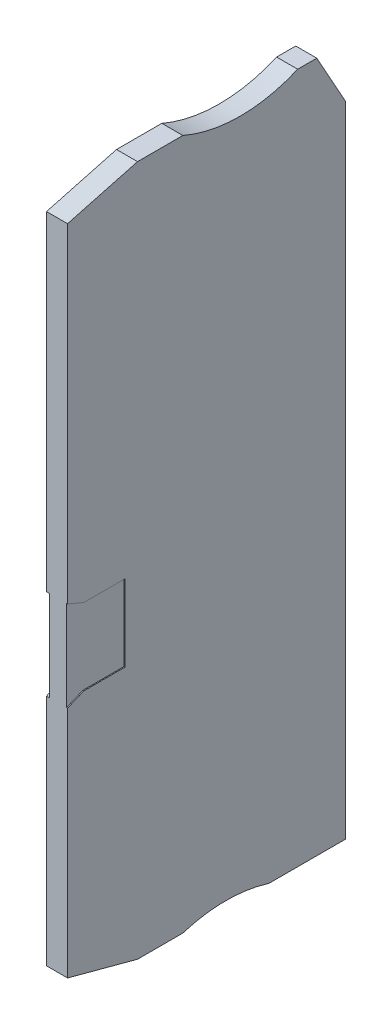
ISO-10303-21;
HEADER;
FILE_DESCRIPTION(('STEP AP214'),'2;1');
FILE_NAME('part.step','',(''),(''),'','','');
FILE_SCHEMA(('AUTOMOTIVE_DESIGN { 1 0 10303 214 1 1 1 1 }'));
ENDSEC;
DATA;
#1=APPLICATION_CONTEXT('core data for automotive mechanical design processes');
#2=APPLICATION_PROTOCOL_DEFINITION('international standard','automotive_design',2000,#1);
#3=PRODUCT_CONTEXT('',#1,'mechanical');
#4=PRODUCT('Part','Part','',(#3));
#5=PRODUCT_RELATED_PRODUCT_CATEGORY('part','',(#4));
#6=PRODUCT_DEFINITION_FORMATION('','',#4);
#7=PRODUCT_DEFINITION_CONTEXT('part definition',#1,'design');
#8=PRODUCT_DEFINITION('design','',#6,#7);
#9=PRODUCT_DEFINITION_SHAPE('','',#8);
#10=(LENGTH_UNIT() NAMED_UNIT(*) SI_UNIT(.MILLI.,.METRE.));
#11=(NAMED_UNIT(*) PLANE_ANGLE_UNIT() SI_UNIT($,.RADIAN.));
#12=(NAMED_UNIT(*) SI_UNIT($,.STERADIAN.) SOLID_ANGLE_UNIT());
#13=UNCERTAINTY_MEASURE_WITH_UNIT(LENGTH_MEASURE(1.E-05),#10,'distance_accuracy_value','');
#14=(GEOMETRIC_REPRESENTATION_CONTEXT(3) GLOBAL_UNCERTAINTY_ASSIGNED_CONTEXT((#13)) GLOBAL_UNIT_ASSIGNED_CONTEXT((#10,
#11,#12)) REPRESENTATION_CONTEXT('',''));
#15=CARTESIAN_POINT('',(0.,0.,0.));
#16=DIRECTION('',(0.,0.,1.));
#17=DIRECTION('',(1.,0.,0.));
#18=AXIS2_PLACEMENT_3D('',#15,#16,#17);
#19=CARTESIAN_POINT('',(0.,27.1000000000009,27.3499999999963));
#20=DIRECTION('',(0.,-0.92110933002153,-0.389303997086196));
#21=DIRECTION('',(0.,0.389303997086196,-0.92110933002153));
#22=AXIS2_PLACEMENT_3D('',#19,#20,#21);
#23=PLANE('',#22);
#24=DIRECTION('',(0.,0.389303997086173,-0.921109330021539));
#25=VECTOR('',#24,1.);
#26=CARTESIAN_POINT('',(0.299999999999995,26.3815002807196,29.0499999999999));
#27=LINE('',#26,#25);
#28=CARTESIAN_POINT('',(0.299999999999995,26.3815002807196,29.0499999999999));
#29=VERTEX_POINT('',#28);
#30=CARTESIAN_POINT('',(0.299999999999995,27.1000000000009,27.3499999999963));
#31=VERTEX_POINT('',#30);
#32=EDGE_CURVE('E236',#29,#31,#27,.T.);
#33=ORIENTED_EDGE('',*,*,#32,.T.);
#34=DIRECTION('',(1.,0.,0.));
#35=VECTOR('',#34,1.);
#36=CARTESIAN_POINT('',(0.,27.1000000000009,27.3499999999963));
#37=LINE('',#36,#35);
#38=CARTESIAN_POINT('',(0.,27.1000000000009,27.3499999999963));
#39=VERTEX_POINT('',#38);
#40=EDGE_CURVE('E285',#31,#39,#37,.F.);
#41=ORIENTED_EDGE('',*,*,#40,.T.);
#42=DIRECTION('',(0.,0.389303997086205,-0.921109330021526));
#43=VECTOR('',#42,1.);
#44=CARTESIAN_POINT('',(0.,26.3815002807195,29.0499999999999));
#45=LINE('',#44,#43);
#46=CARTESIAN_POINT('',(0.,26.3815002807196,29.0499999999999));
#47=VERTEX_POINT('',#46);
#48=EDGE_CURVE('E216',#47,#39,#45,.T.);
#49=ORIENTED_EDGE('',*,*,#48,.F.);
#50=DIRECTION('',(1.,0.,0.));
#51=VECTOR('',#50,1.);
#52=CARTESIAN_POINT('',(0.,26.3815002807196,29.0499999999998));
#53=LINE('',#52,#51);
#54=EDGE_CURVE('E288',#29,#47,#53,.F.);
#55=ORIENTED_EDGE('',*,*,#54,.F.);
#56=EDGE_LOOP('',(#33,#41,#49,#55));
#57=FACE_BOUND('',#56,.T.);
#58=ADVANCED_FACE('F16',(#57),#23,.F.);
#59=CARTESIAN_POINT('',(0.,27.100000000001,23.0499999999996));
#60=DIRECTION('',(0.,-1.,0.));
#61=DIRECTION('',(0.,0.,-1.));
#62=AXIS2_PLACEMENT_3D('',#59,#60,#61);
#63=PLANE('',#62);
#64=DIRECTION('',(0.,0.,1.));
#65=VECTOR('',#64,1.);
#66=CARTESIAN_POINT('',(0.299999999999995,27.1000000000009,3.5249999999996));
#67=LINE('',#66,#65);
#68=CARTESIAN_POINT('',(0.299999999999995,27.100000000001,23.0499999999996));
#69=VERTEX_POINT('',#68);
#70=EDGE_CURVE('E233',#31,#69,#67,.F.);
#71=ORIENTED_EDGE('',*,*,#70,.T.);
#72=DIRECTION('',(1.,0.,0.));
#73=VECTOR('',#72,1.);
#74=CARTESIAN_POINT('',(0.,27.100000000001,23.0499999999996));
#75=LINE('',#74,#73);
#76=CARTESIAN_POINT('',(0.,27.100000000001,23.0499999999996));
#77=VERTEX_POINT('',#76);
#78=EDGE_CURVE('E282',#69,#77,#75,.F.);
#79=ORIENTED_EDGE('',*,*,#78,.T.);
#80=DIRECTION('',(0.,0.,1.));
#81=VECTOR('',#80,1.);
#82=CARTESIAN_POINT('',(0.,27.1000000000009,15.8478507939208));
#83=LINE('',#82,#81);
#84=EDGE_CURVE('E214',#39,#77,#83,.F.);
#85=ORIENTED_EDGE('',*,*,#84,.F.);
#86=ORIENTED_EDGE('',*,*,#40,.F.);
#87=EDGE_LOOP('',(#71,#79,#85,#86));
#88=FACE_BOUND('',#87,.T.);
#89=ADVANCED_FACE('F641',(#88),#63,.F.);
#90=CARTESIAN_POINT('',(0.,35.1000000000007,23.0499999999996));
#91=DIRECTION('',(0.,0.,-1.));
#92=DIRECTION('',(0.,1.,0.));
#93=AXIS2_PLACEMENT_3D('',#90,#91,#92);
#94=PLANE('',#93);
#95=DIRECTION('',(0.,1.,0.));
#96=VECTOR('',#95,1.);
#97=CARTESIAN_POINT('',(0.299999999999995,35.1375339919866,23.0499999999996));
#98=LINE('',#97,#96);
#99=CARTESIAN_POINT('',(0.299999999999995,35.1000000000007,23.0499999999996));
#100=VERTEX_POINT('',#99);
#101=EDGE_CURVE('E230',#69,#100,#98,.T.);
#102=ORIENTED_EDGE('',*,*,#101,.T.);
#103=DIRECTION('',(1.,0.,0.));
#104=VECTOR('',#103,1.);
#105=CARTESIAN_POINT('',(0.,35.1000000000007,23.0499999999996));
#106=LINE('',#105,#104);
#107=CARTESIAN_POINT('',(0.,35.1000000000007,23.0499999999996));
#108=VERTEX_POINT('',#107);
#109=EDGE_CURVE('E279',#100,#108,#106,.F.);
#110=ORIENTED_EDGE('',*,*,#109,.T.);
#111=DIRECTION('',(0.,-1.,0.));
#112=VECTOR('',#111,1.);
#113=CARTESIAN_POINT('',(0.,29.4869492142201,23.0499999999996));
#114=LINE('',#113,#112);
#115=EDGE_CURVE('E212',#77,#108,#114,.F.);
#116=ORIENTED_EDGE('',*,*,#115,.F.);
#117=ORIENTED_EDGE('',*,*,#78,.F.);
#118=EDGE_LOOP('',(#102,#110,#116,#117));
#119=FACE_BOUND('',#118,.T.);
#120=ADVANCED_FACE('F631',(#119),#94,.F.);
#121=CARTESIAN_POINT('',(0.,35.1000000000007,27.350000000049));
#122=DIRECTION('',(0.,1.,0.));
#123=DIRECTION('',(0.,0.,1.));
#124=AXIS2_PLACEMENT_3D('',#121,#122,#123);
#125=PLANE('',#124);
#126=DIRECTION('',(0.,0.,1.));
#127=VECTOR('',#126,1.);
#128=CARTESIAN_POINT('',(0.299999999999995,35.1000000000007,3.5249999999996));
#129=LINE('',#128,#127);
#130=CARTESIAN_POINT('',(0.299999999999995,35.1000000000007,27.350000000049));
#131=VERTEX_POINT('',#130);
#132=EDGE_CURVE('E227',#100,#131,#129,.T.);
#133=ORIENTED_EDGE('',*,*,#132,.T.);
#134=DIRECTION('',(1.,0.,0.));
#135=VECTOR('',#134,1.);
#136=CARTESIAN_POINT('',(0.,35.1000000000007,27.350000000049));
#137=LINE('',#136,#135);
#138=CARTESIAN_POINT('',(0.,35.1000000000007,27.350000000049));
#139=VERTEX_POINT('',#138);
#140=EDGE_CURVE('E239',#131,#139,#137,.F.);
#141=ORIENTED_EDGE('',*,*,#140,.T.);
#142=DIRECTION('',(0.,0.,1.));
#143=VECTOR('',#142,1.);
#144=CARTESIAN_POINT('',(0.,35.1000000000007,15.8478507939208));
#145=LINE('',#144,#143);
#146=EDGE_CURVE('E210',#108,#139,#145,.T.);
#147=ORIENTED_EDGE('',*,*,#146,.F.);
#148=ORIENTED_EDGE('',*,*,#109,.F.);
#149=EDGE_LOOP('',(#133,#141,#147,#148));
#150=FACE_BOUND('',#149,.T.);
#151=ADVANCED_FACE('F621',(#150),#125,.F.);
#152=CARTESIAN_POINT('',(0.,35.8184997192858,29.0499999999996));
#153=DIRECTION('',(0.,0.921109330016461,-0.389303997098189));
#154=DIRECTION('',(0.,0.389303997098189,0.921109330016461));
#155=AXIS2_PLACEMENT_3D('',#152,#153,#154);
#156=PLANE('',#155);
#157=DIRECTION('',(0.,0.389303997098142,0.921109330016481));
#158=VECTOR('',#157,1.);
#159=CARTESIAN_POINT('',(0.299999999999995,35.1000000000007,27.350000000049));
#160=LINE('',#159,#158);
#161=CARTESIAN_POINT('',(0.299999999999995,35.8184997192859,29.0499999999998));
#162=VERTEX_POINT('',#161);
#163=EDGE_CURVE('E218',#131,#162,#160,.T.);
#164=ORIENTED_EDGE('',*,*,#163,.T.);
#165=DIRECTION('',(1.,0.,0.));
#166=VECTOR('',#165,1.);
#167=CARTESIAN_POINT('',(0.,35.8184997192859,29.0499999999998));
#168=LINE('',#167,#166);
#169=CARTESIAN_POINT('',(0.,35.8184997192859,29.0499999999998));
#170=VERTEX_POINT('',#169);
#171=EDGE_CURVE('E277',#170,#162,#168,.T.);
#172=ORIENTED_EDGE('',*,*,#171,.F.);
#173=DIRECTION('',(0.,0.389303997098142,0.921109330016481));
#174=VECTOR('',#173,1.);
#175=CARTESIAN_POINT('',(0.,35.1000000000007,27.350000000049));
#176=LINE('',#175,#174);
#177=EDGE_CURVE('E207',#139,#170,#176,.T.);
#178=ORIENTED_EDGE('',*,*,#177,.F.);
#179=ORIENTED_EDGE('',*,*,#140,.F.);
#180=EDGE_LOOP('',(#164,#172,#178,#179));
#181=FACE_BOUND('',#180,.T.);
#182=ADVANCED_FACE('F611',(#181),#156,.F.);
#183=CARTESIAN_POINT('',(0.299999999999995,35.1375339919866,3.5249999999996));
#184=DIRECTION('',(1.,0.,0.));
#185=DIRECTION('',(0.,1.,0.));
#186=AXIS2_PLACEMENT_3D('',#183,#184,#185);
#187=PLANE('',#186);
#188=ORIENTED_EDGE('',*,*,#163,.F.);
#189=ORIENTED_EDGE('',*,*,#132,.F.);
#190=ORIENTED_EDGE('',*,*,#101,.F.);
#191=ORIENTED_EDGE('',*,*,#70,.F.);
#192=ORIENTED_EDGE('',*,*,#32,.F.);
#193=DIRECTION('',(0.,1.,0.));
#194=VECTOR('',#193,1.);
#195=CARTESIAN_POINT('',(0.299999999999995,34.8047248473129,29.0499999999999));
#196=LINE('',#195,#194);
#197=EDGE_CURVE('E254',#162,#29,#196,.F.);
#198=ORIENTED_EDGE('',*,*,#197,.F.);
#199=EDGE_LOOP('',(#188,#189,#190,#191,#192,#198));
#200=FACE_BOUND('',#199,.T.);
#201=ADVANCED_FACE('F601',(#200),#187,.F.);
#202=CARTESIAN_POINT('',(2.1,35.1375339919866,3.5249999999996));
#203=DIRECTION('',(1.,0.,0.));
#204=DIRECTION('',(0.,1.,0.));
#205=AXIS2_PLACEMENT_3D('',#202,#203,#204);
#206=PLANE('',#205);
#207=DIRECTION('',(0.,-0.389303997098189,-0.921109330016461));
#208=VECTOR('',#207,1.);
#209=CARTESIAN_POINT('',(2.1,35.8184997192858,29.0499999999996));
#210=LINE('',#209,#208);
#211=CARTESIAN_POINT('',(2.1,35.8184997192858,29.0499999999999));
#212=VERTEX_POINT('',#211);
#213=CARTESIAN_POINT('',(2.1,35.1000000000007,27.350000000049));
#214=VERTEX_POINT('',#213);
#215=EDGE_CURVE('E358',#212,#214,#210,.T.);
#216=ORIENTED_EDGE('',*,*,#215,.F.);
#217=DIRECTION('',(0.,1.,0.));
#218=VECTOR('',#217,1.);
#219=CARTESIAN_POINT('',(2.1,34.8047248473129,29.0499999999999));
#220=LINE('',#219,#218);
#221=CARTESIAN_POINT('',(2.1,26.3815002807196,29.0499999999999));
#222=VERTEX_POINT('',#221);
#223=EDGE_CURVE('E347',#222,#212,#220,.T.);
#224=ORIENTED_EDGE('',*,*,#223,.F.);
#225=DIRECTION('',(0.,-0.389303997086196,0.92110933002153));
#226=VECTOR('',#225,1.);
#227=CARTESIAN_POINT('',(2.1,27.1000000000009,27.3499999999963));
#228=LINE('',#227,#226);
#229=CARTESIAN_POINT('',(2.1,27.1000000000009,27.3499999999963));
#230=VERTEX_POINT('',#229);
#231=EDGE_CURVE('E372',#230,#222,#228,.T.);
#232=ORIENTED_EDGE('',*,*,#231,.F.);
#233=DIRECTION('',(0.,0.,1.));
#234=VECTOR('',#233,1.);
#235=CARTESIAN_POINT('',(2.1,27.100000000001,23.0499999999996));
#236=LINE('',#235,#234);
#237=CARTESIAN_POINT('',(2.1,27.100000000001,23.0499999999996));
#238=VERTEX_POINT('',#237);
#239=EDGE_CURVE('E370',#238,#230,#236,.T.);
#240=ORIENTED_EDGE('',*,*,#239,.F.);
#241=DIRECTION('',(0.,-1.,0.));
#242=VECTOR('',#241,1.);
#243=CARTESIAN_POINT('',(2.1,35.1000000000007,23.0499999999996));
#244=LINE('',#243,#242);
#245=CARTESIAN_POINT('',(2.1,35.1000000000007,23.0499999999996));
#246=VERTEX_POINT('',#245);
#247=EDGE_CURVE('E366',#246,#238,#244,.T.);
#248=ORIENTED_EDGE('',*,*,#247,.F.);
#249=DIRECTION('',(0.,0.,-1.));
#250=VECTOR('',#249,1.);
#251=CARTESIAN_POINT('',(2.1,35.1000000000007,27.350000000049));
#252=LINE('',#251,#250);
#253=EDGE_CURVE('E362',#214,#246,#252,.T.);
#254=ORIENTED_EDGE('',*,*,#253,.F.);
#255=EDGE_LOOP('',(#216,#224,#232,#240,#248,#254));
#256=FACE_BOUND('',#255,.T.);
#257=ADVANCED_FACE('F592',(#256),#206,.T.);
#258=CARTESIAN_POINT('',(0.,29.4869492142201,15.8478507939208));
#259=DIRECTION('',(-1.,0.,0.));
#260=DIRECTION('',(0.,-1.,0.));
#261=AXIS2_PLACEMENT_3D('',#258,#259,#260);
#262=PLANE('',#261);
#263=ORIENTED_EDGE('',*,*,#146,.T.);
#264=ORIENTED_EDGE('',*,*,#177,.T.);
#265=DIRECTION('',(0.,1.,0.));
#266=VECTOR('',#265,1.);
#267=CARTESIAN_POINT('',(0.,34.8047248473129,29.0499999999999));
#268=LINE('',#267,#266);
#269=CARTESIAN_POINT('',(0.,70.2398057706538,29.0499999999999));
#270=VERTEX_POINT('',#269);
#271=EDGE_CURVE('E353',#270,#170,#268,.F.);
#272=ORIENTED_EDGE('',*,*,#271,.F.);
#273=DIRECTION('',(0.,-0.258819045103111,0.96592582628891));
#274=VECTOR('',#273,1.);
#275=CARTESIAN_POINT('',(0.,72.1829629131446,21.7980388171514));
#276=LINE('',#275,#274);
#277=CARTESIAN_POINT('',(0.,72.2000000000002,21.7344555433937));
#278=VERTEX_POINT('',#277);
#279=EDGE_CURVE('E201',#278,#270,#276,.T.);
#280=ORIENTED_EDGE('',*,*,#279,.F.);
#281=DIRECTION('',(0.,0.,1.));
#282=VECTOR('',#281,1.);
#283=CARTESIAN_POINT('',(0.,72.2000000000002,21.6896614365334));
#284=LINE('',#283,#282);
#285=CARTESIAN_POINT('',(0.,72.2000000000002,16.9999999999988));
#286=VERTEX_POINT('',#285);
#287=EDGE_CURVE('E167',#286,#278,#284,.T.);
#288=ORIENTED_EDGE('',*,*,#287,.F.);
#289=CARTESIAN_POINT('',(0.,85.9477270848677,10.9999999999988));
#290=DIRECTION('',(1.,0.,0.));
#291=DIRECTION('',(0.,1.,0.));
#292=AXIS2_PLACEMENT_3D('',#289,#290,#291);
#293=CIRCLE('',#292,15.);
#294=CARTESIAN_POINT('',(0.,72.2000000000002,4.99999999999878));
#295=VERTEX_POINT('',#294);
#296=EDGE_CURVE('E19',#286,#295,#293,.T.);
#297=ORIENTED_EDGE('',*,*,#296,.T.);
#298=DIRECTION('',(0.,0.,1.));
#299=VECTOR('',#298,1.);
#300=CARTESIAN_POINT('',(0.,72.2000000000002,4.9999999999988));
#301=LINE('',#300,#299);
#302=CARTESIAN_POINT('',(0.,72.2000000000002,3.00000000000143));
#303=VERTEX_POINT('',#302);
#304=EDGE_CURVE('E173',#303,#295,#301,.T.);
#305=ORIENTED_EDGE('',*,*,#304,.F.);
#306=DIRECTION('',(0.,0.874435210897321,0.485142311021166));
#307=VECTOR('',#306,1.);
#308=CARTESIAN_POINT('',(0.,67.2453526060156,0.251129578205306));
#309=LINE('',#308,#307);
#310=CARTESIAN_POINT('',(0.,66.7927090400105,0.));
#311=VERTEX_POINT('',#310);
#312=EDGE_CURVE('E190',#311,#303,#309,.T.);
#313=ORIENTED_EDGE('',*,*,#312,.F.);
#314=DIRECTION('',(0.,1.,0.));
#315=VECTOR('',#314,1.);
#316=CARTESIAN_POINT('',(0.,66.7462921681226,0.));
#317=LINE('',#316,#315);
#318=CARTESIAN_POINT('',(0.,0.,0.));
#319=VERTEX_POINT('',#318);
#320=EDGE_CURVE('E267',#319,#311,#317,.T.);
#321=ORIENTED_EDGE('',*,*,#320,.F.);
#322=DIRECTION('',(0.,0.,1.));
#323=VECTOR('',#322,1.);
#324=CARTESIAN_POINT('',(0.,0.,7.7027457942074));
#325=LINE('',#324,#323);
#326=CARTESIAN_POINT('',(0.,0.,7.99999999999881));
#327=VERTEX_POINT('',#326);
#328=EDGE_CURVE('E261',#327,#319,#325,.F.);
#329=ORIENTED_EDGE('',*,*,#328,.F.);
#330=CARTESIAN_POINT('',(0.,-14.3090880212543,12.4999999999988));
#331=DIRECTION('',(1.,0.,0.));
#332=DIRECTION('',(0.,1.,0.));
#333=AXIS2_PLACEMENT_3D('',#330,#331,#332);
#334=CIRCLE('',#333,15.);
#335=CARTESIAN_POINT('',(0.,0.,16.9999999999987));
#336=VERTEX_POINT('',#335);
#337=EDGE_CURVE('E243',#327,#336,#334,.T.);
#338=ORIENTED_EDGE('',*,*,#337,.T.);
#339=DIRECTION('',(0.,0.,1.));
#340=VECTOR('',#339,1.);
#341=CARTESIAN_POINT('',(0.,0.,21.6686292945984));
#342=LINE('',#341,#340);
#343=CARTESIAN_POINT('',(0.,0.,21.7344555433922));
#344=VERTEX_POINT('',#343);
#345=EDGE_CURVE('E240',#344,#336,#342,.F.);
#346=ORIENTED_EDGE('',*,*,#345,.F.);
#347=DIRECTION('',(0.,-0.258819045103118,-0.965925826288908));
#348=VECTOR('',#347,1.);
#349=CARTESIAN_POINT('',(0.,1.86089481019142,28.6794095225508));
#350=LINE('',#349,#348);
#351=CARTESIAN_POINT('',(0.,1.96019422934679,29.0499999999999));
#352=VERTEX_POINT('',#351);
#353=EDGE_CURVE('E246',#352,#344,#350,.T.);
#354=ORIENTED_EDGE('',*,*,#353,.F.);
#355=DIRECTION('',(0.,1.,0.));
#356=VECTOR('',#355,1.);
#357=CARTESIAN_POINT('',(0.,34.8047248473129,29.0499999999999));
#358=LINE('',#357,#356);
#359=EDGE_CURVE('E251',#47,#352,#358,.F.);
#360=ORIENTED_EDGE('',*,*,#359,.F.);
#361=ORIENTED_EDGE('',*,*,#48,.T.);
#362=ORIENTED_EDGE('',*,*,#84,.T.);
#363=ORIENTED_EDGE('',*,*,#115,.T.);
#364=EDGE_LOOP('',(#263,#264,#272,#280,#288,#297,#305,#313,#321,#329,#338,#346,#354,#360,#361,
#362,#363));
#365=FACE_BOUND('',#364,.T.);
#366=ADVANCED_FACE('F182',(#365),#262,.T.);
#367=CARTESIAN_POINT('',(0.,72.2000000000002,21.6896614365334));
#368=DIRECTION('',(0.,1.,0.));
#369=DIRECTION('',(-1.,0.,0.));
#370=AXIS2_PLACEMENT_3D('',#367,#368,#369);
#371=PLANE('',#370);
#372=DIRECTION('',(1.,0.,0.));
#373=VECTOR('',#372,1.);
#374=CARTESIAN_POINT('',(2.19999999999999,72.2000000000002,16.9999999999988));
#375=LINE('',#374,#373);
#376=CARTESIAN_POINT('',(2.19999999999999,72.2000000000002,16.9999999999988));
#377=VERTEX_POINT('',#376);
#378=EDGE_CURVE('E185',#377,#286,#375,.F.);
#379=ORIENTED_EDGE('',*,*,#378,.T.);
#380=ORIENTED_EDGE('',*,*,#287,.T.);
#381=DIRECTION('',(1.,0.,0.));
#382=VECTOR('',#381,1.);
#383=CARTESIAN_POINT('',(2.19999999999999,72.2000000000002,21.7344555433937));
#384=LINE('',#383,#382);
#385=CARTESIAN_POINT('',(2.19999999999999,72.2000000000002,21.7344555433937));
#386=VERTEX_POINT('',#385);
#387=EDGE_CURVE('E198',#386,#278,#384,.F.);
#388=ORIENTED_EDGE('',*,*,#387,.F.);
#389=DIRECTION('',(0.,0.,1.));
#390=VECTOR('',#389,1.);
#391=CARTESIAN_POINT('',(2.19999999999999,72.2000000000002,15.8478507939208));
#392=LINE('',#391,#390);
#393=EDGE_CURVE('E296',#386,#377,#392,.F.);
#394=ORIENTED_EDGE('',*,*,#393,.T.);
#395=EDGE_LOOP('',(#379,#380,#388,#394));
#396=FACE_BOUND('',#395,.T.);
#397=ADVANCED_FACE('F574',(#396),#371,.T.);
#398=CARTESIAN_POINT('',(2.19999999999998,85.9477270848677,10.9999999999988));
#399=DIRECTION('',(1.,0.,0.));
#400=DIRECTION('',(0.,1.,0.));
#401=AXIS2_PLACEMENT_3D('',#398,#399,#400);
#402=CYLINDRICAL_SURFACE('',#401,15.);
#403=DIRECTION('',(-1.,0.,0.));
#404=VECTOR('',#403,1.);
#405=CARTESIAN_POINT('',(0.,72.2000000000002,4.9999999999988));
#406=LINE('',#405,#404);
#407=CARTESIAN_POINT('',(2.19999999999999,72.2000000000002,4.99999999999878));
#408=VERTEX_POINT('',#407);
#409=EDGE_CURVE('E177',#295,#408,#406,.F.);
#410=ORIENTED_EDGE('',*,*,#409,.F.);
#411=ORIENTED_EDGE('',*,*,#296,.F.);
#412=ORIENTED_EDGE('',*,*,#378,.F.);
#413=CARTESIAN_POINT('',(2.19999999999998,85.9477270848677,10.9999999999988));
#414=DIRECTION('',(1.,0.,0.));
#415=DIRECTION('',(0.,1.,0.));
#416=AXIS2_PLACEMENT_3D('',#413,#414,#415);
#417=CIRCLE('',#416,15.);
#418=EDGE_CURVE('E189',#377,#408,#417,.T.);
#419=ORIENTED_EDGE('',*,*,#418,.T.);
#420=EDGE_LOOP('',(#410,#411,#412,#419));
#421=FACE_BOUND('',#420,.T.);
#422=ADVANCED_FACE('F187',(#421),#402,.F.);
#423=CARTESIAN_POINT('',(0.,72.2000000000002,4.9999999999988));
#424=DIRECTION('',(0.,1.,0.));
#425=DIRECTION('',(-1.,0.,0.));
#426=AXIS2_PLACEMENT_3D('',#423,#424,#425);
#427=PLANE('',#426);
#428=ORIENTED_EDGE('',*,*,#409,.T.);
#429=DIRECTION('',(0.,0.,1.));
#430=VECTOR('',#429,1.);
#431=CARTESIAN_POINT('',(2.19999999999999,72.2000000000002,15.8478507939208));
#432=LINE('',#431,#430);
#433=CARTESIAN_POINT('',(2.19999999999999,72.2000000000002,3.00000000000148));
#434=VERTEX_POINT('',#433);
#435=EDGE_CURVE('E295',#408,#434,#432,.F.);
#436=ORIENTED_EDGE('',*,*,#435,.T.);
#437=DIRECTION('',(1.,0.,0.));
#438=VECTOR('',#437,1.);
#439=CARTESIAN_POINT('',(2.19999999999999,72.2000000000003,3.00000000000143));
#440=LINE('',#439,#438);
#441=EDGE_CURVE('E179',#303,#434,#440,.T.);
#442=ORIENTED_EDGE('',*,*,#441,.F.);
#443=ORIENTED_EDGE('',*,*,#304,.T.);
#444=EDGE_LOOP('',(#428,#436,#442,#443));
#445=FACE_BOUND('',#444,.T.);
#446=ADVANCED_FACE('F174',(#445),#427,.T.);
#447=CARTESIAN_POINT('',(2.19999999999999,67.2453526060156,0.251129578205306));
#448=DIRECTION('',(0.,0.485142311021166,-0.874435210897321));
#449=DIRECTION('',(0.,0.874435210897321,0.485142311021166));
#450=AXIS2_PLACEMENT_3D('',#447,#448,#449);
#451=PLANE('',#450);
#452=ORIENTED_EDGE('',*,*,#312,.T.);
#453=ORIENTED_EDGE('',*,*,#441,.T.);
#454=DIRECTION('',(0.,-0.87443521089732,-0.485142311021168));
#455=VECTOR('',#454,1.);
#456=CARTESIAN_POINT('',(2.19999999999999,72.2000000000002,3.00000000000151));
#457=LINE('',#456,#455);
#458=CARTESIAN_POINT('',(2.19999999999999,66.7927090400105,0.));
#459=VERTEX_POINT('',#458);
#460=EDGE_CURVE('E316',#434,#459,#457,.T.);
#461=ORIENTED_EDGE('',*,*,#460,.T.);
#462=DIRECTION('',(-1.,0.,0.));
#463=VECTOR('',#462,1.);
#464=CARTESIAN_POINT('',(0.,66.7927090400105,0.));
#465=LINE('',#464,#463);
#466=EDGE_CURVE('E264',#311,#459,#465,.F.);
#467=ORIENTED_EDGE('',*,*,#466,.F.);
#468=EDGE_LOOP('',(#452,#453,#461,#467));
#469=FACE_BOUND('',#468,.T.);
#470=ADVANCED_FACE('F327',(#469),#451,.T.);
#471=CARTESIAN_POINT('',(0.,66.7462921681226,0.));
#472=DIRECTION('',(0.,0.,-1.));
#473=DIRECTION('',(-1.,0.,0.));
#474=AXIS2_PLACEMENT_3D('',#471,#472,#473);
#475=PLANE('',#474);
#476=ORIENTED_EDGE('',*,*,#466,.T.);
#477=DIRECTION('',(0.,-1.,0.));
#478=VECTOR('',#477,1.);
#479=CARTESIAN_POINT('',(2.19999999999999,29.4869492142201,0.));
#480=LINE('',#479,#478);
#481=CARTESIAN_POINT('',(2.2,0.,0.));
#482=VERTEX_POINT('',#481);
#483=EDGE_CURVE('E313',#459,#482,#480,.T.);
#484=ORIENTED_EDGE('',*,*,#483,.T.);
#485=DIRECTION('',(1.,0.,0.));
#486=VECTOR('',#485,1.);
#487=CARTESIAN_POINT('',(2.2,0.,0.));
#488=LINE('',#487,#486);
#489=EDGE_CURVE('E263',#319,#482,#488,.T.);
#490=ORIENTED_EDGE('',*,*,#489,.F.);
#491=ORIENTED_EDGE('',*,*,#320,.T.);
#492=EDGE_LOOP('',(#476,#484,#490,#491));
#493=FACE_BOUND('',#492,.T.);
#494=ADVANCED_FACE('F402',(#493),#475,.T.);
#495=CARTESIAN_POINT('',(2.2,0.,7.7027457942074));
#496=DIRECTION('',(0.,-1.,0.));
#497=DIRECTION('',(1.,0.,0.));
#498=AXIS2_PLACEMENT_3D('',#495,#496,#497);
#499=PLANE('',#498);
#500=ORIENTED_EDGE('',*,*,#328,.T.);
#501=ORIENTED_EDGE('',*,*,#489,.T.);
#502=DIRECTION('',(0.,0.,1.));
#503=VECTOR('',#502,1.);
#504=CARTESIAN_POINT('',(2.2,0.,15.8478507939208));
#505=LINE('',#504,#503);
#506=CARTESIAN_POINT('',(2.2,0.,7.99999999999881));
#507=VERTEX_POINT('',#506);
#508=EDGE_CURVE('E294',#482,#507,#505,.T.);
#509=ORIENTED_EDGE('',*,*,#508,.T.);
#510=DIRECTION('',(1.,0.,0.));
#511=VECTOR('',#510,1.);
#512=CARTESIAN_POINT('',(2.2,0.,7.99999999999879));
#513=LINE('',#512,#511);
#514=EDGE_CURVE('E298',#507,#327,#513,.F.);
#515=ORIENTED_EDGE('',*,*,#514,.T.);
#516=EDGE_LOOP('',(#500,#501,#509,#515));
#517=FACE_BOUND('',#516,.T.);
#518=ADVANCED_FACE('F399',(#517),#499,.T.);
#519=CARTESIAN_POINT('',(2.20000000000001,-14.3090880212543,12.4999999999988));
#520=DIRECTION('',(1.,0.,0.));
#521=DIRECTION('',(0.,1.,0.));
#522=AXIS2_PLACEMENT_3D('',#519,#520,#521);
#523=CYLINDRICAL_SURFACE('',#522,15.);
#524=DIRECTION('',(1.,0.,0.));
#525=VECTOR('',#524,1.);
#526=CARTESIAN_POINT('',(2.2,0.,16.9999999999987));
#527=LINE('',#526,#525);
#528=CARTESIAN_POINT('',(2.2,0.,16.9999999999987));
#529=VERTEX_POINT('',#528);
#530=EDGE_CURVE('E242',#336,#529,#527,.T.);
#531=ORIENTED_EDGE('',*,*,#530,.F.);
#532=ORIENTED_EDGE('',*,*,#337,.F.);
#533=ORIENTED_EDGE('',*,*,#514,.F.);
#534=CARTESIAN_POINT('',(2.20000000000001,-14.3090880212543,12.4999999999988));
#535=DIRECTION('',(1.,0.,0.));
#536=DIRECTION('',(0.,1.,0.));
#537=AXIS2_PLACEMENT_3D('',#534,#535,#536);
#538=CIRCLE('',#537,15.);
#539=EDGE_CURVE('E290',#507,#529,#538,.T.);
#540=ORIENTED_EDGE('',*,*,#539,.T.);
#541=EDGE_LOOP('',(#531,#532,#533,#540));
#542=FACE_BOUND('',#541,.T.);
#543=ADVANCED_FACE('F405',(#542),#523,.F.);
#544=CARTESIAN_POINT('',(2.2,0.,21.6686292945984));
#545=DIRECTION('',(0.,-1.,0.));
#546=DIRECTION('',(1.,0.,0.));
#547=AXIS2_PLACEMENT_3D('',#544,#545,#546);
#548=PLANE('',#547);
#549=ORIENTED_EDGE('',*,*,#345,.T.);
#550=ORIENTED_EDGE('',*,*,#530,.T.);
#551=DIRECTION('',(0.,0.,1.));
#552=VECTOR('',#551,1.);
#553=CARTESIAN_POINT('',(2.2,0.,15.8478507939208));
#554=LINE('',#553,#552);
#555=CARTESIAN_POINT('',(2.2,0.,21.7344555433922));
#556=VERTEX_POINT('',#555);
#557=EDGE_CURVE('E293',#529,#556,#554,.T.);
#558=ORIENTED_EDGE('',*,*,#557,.T.);
#559=DIRECTION('',(1.,0.,0.));
#560=VECTOR('',#559,1.);
#561=CARTESIAN_POINT('',(2.2,0.,21.7344555433922));
#562=LINE('',#561,#560);
#563=EDGE_CURVE('E248',#344,#556,#562,.T.);
#564=ORIENTED_EDGE('',*,*,#563,.F.);
#565=EDGE_LOOP('',(#549,#550,#558,#564));
#566=FACE_BOUND('',#565,.T.);
#567=ADVANCED_FACE('F393',(#566),#548,.T.);
#568=CARTESIAN_POINT('',(2.2,1.86089481019142,28.6794095225508));
#569=DIRECTION('',(0.,-0.965925826288908,0.258819045103118));
#570=DIRECTION('',(0.,-0.258819045103118,-0.965925826288908));
#571=AXIS2_PLACEMENT_3D('',#568,#569,#570);
#572=PLANE('',#571);
#573=ORIENTED_EDGE('',*,*,#353,.T.);
#574=ORIENTED_EDGE('',*,*,#563,.T.);
#575=DIRECTION('',(0.,0.258819045103125,0.965925826288906));
#576=VECTOR('',#575,1.);
#577=CARTESIAN_POINT('',(2.2,0.,21.7344555433922));
#578=LINE('',#577,#576);
#579=CARTESIAN_POINT('',(2.2,1.9601942293468,29.0499999999999));
#580=VERTEX_POINT('',#579);
#581=EDGE_CURVE('E375',#556,#580,#578,.T.);
#582=ORIENTED_EDGE('',*,*,#581,.T.);
#583=DIRECTION('',(1.,0.,0.));
#584=VECTOR('',#583,1.);
#585=CARTESIAN_POINT('',(0.,1.96019422934682,29.0499999999999));
#586=LINE('',#585,#584);
#587=EDGE_CURVE('E253',#352,#580,#586,.T.);
#588=ORIENTED_EDGE('',*,*,#587,.F.);
#589=EDGE_LOOP('',(#573,#574,#582,#588));
#590=FACE_BOUND('',#589,.T.);
#591=ADVANCED_FACE('F383',(#590),#572,.T.);
#592=CARTESIAN_POINT('',(2.19999999999999,27.1000000000009,27.3499999999963));
#593=DIRECTION('',(0.,0.92110933002153,0.389303997086196));
#594=DIRECTION('',(0.,-0.389303997086196,0.92110933002153));
#595=AXIS2_PLACEMENT_3D('',#592,#593,#594);
#596=PLANE('',#595);
#597=ORIENTED_EDGE('',*,*,#231,.T.);
#598=DIRECTION('',(1.,0.,0.));
#599=VECTOR('',#598,1.);
#600=CARTESIAN_POINT('',(0.,26.3815002807195,29.0499999999999));
#601=LINE('',#600,#599);
#602=CARTESIAN_POINT('',(2.19999999999999,26.3815002807196,29.0499999999999));
#603=VERTEX_POINT('',#602);
#604=EDGE_CURVE('E258',#603,#222,#601,.F.);
#605=ORIENTED_EDGE('',*,*,#604,.F.);
#606=DIRECTION('',(0.,0.389303997086205,-0.921109330021526));
#607=VECTOR('',#606,1.);
#608=CARTESIAN_POINT('',(2.19999999999999,26.3815002807195,29.0499999999999));
#609=LINE('',#608,#607);
#610=CARTESIAN_POINT('',(2.19999999999999,27.1000000000009,27.3499999999963));
#611=VERTEX_POINT('',#610);
#612=EDGE_CURVE('E706',#603,#611,#609,.T.);
#613=ORIENTED_EDGE('',*,*,#612,.T.);
#614=DIRECTION('',(1.,0.,0.));
#615=VECTOR('',#614,1.);
#616=CARTESIAN_POINT('',(2.19999999999999,27.1000000000009,27.3499999999963));
#617=LINE('',#616,#615);
#618=EDGE_CURVE('E368',#230,#611,#617,.T.);
#619=ORIENTED_EDGE('',*,*,#618,.F.);
#620=EDGE_LOOP('',(#597,#605,#613,#619));
#621=FACE_BOUND('',#620,.T.);
#622=ADVANCED_FACE('F442',(#621),#596,.T.);
#623=CARTESIAN_POINT('',(2.19999999999999,27.100000000001,23.0499999999996));
#624=DIRECTION('',(0.,1.,0.));
#625=DIRECTION('',(0.,0.,1.));
#626=AXIS2_PLACEMENT_3D('',#623,#624,#625);
#627=PLANE('',#626);
#628=ORIENTED_EDGE('',*,*,#239,.T.);
#629=ORIENTED_EDGE('',*,*,#618,.T.);
#630=DIRECTION('',(0.,0.,1.));
#631=VECTOR('',#630,1.);
#632=CARTESIAN_POINT('',(2.19999999999999,27.1000000000009,15.8478507939208));
#633=LINE('',#632,#631);
#634=CARTESIAN_POINT('',(2.19999999999999,27.100000000001,23.0499999999996));
#635=VERTEX_POINT('',#634);
#636=EDGE_CURVE('E708',#611,#635,#633,.F.);
#637=ORIENTED_EDGE('',*,*,#636,.T.);
#638=DIRECTION('',(1.,0.,0.));
#639=VECTOR('',#638,1.);
#640=CARTESIAN_POINT('',(2.19999999999999,27.100000000001,23.0499999999996));
#641=LINE('',#640,#639);
#642=EDGE_CURVE('E364',#238,#635,#641,.T.);
#643=ORIENTED_EDGE('',*,*,#642,.F.);
#644=EDGE_LOOP('',(#628,#629,#637,#643));
#645=FACE_BOUND('',#644,.T.);
#646=ADVANCED_FACE('F438',(#645),#627,.T.);
#647=CARTESIAN_POINT('',(2.19999999999999,35.1000000000007,23.0499999999996));
#648=DIRECTION('',(0.,0.,1.));
#649=DIRECTION('',(0.,-1.,0.));
#650=AXIS2_PLACEMENT_3D('',#647,#648,#649);
#651=PLANE('',#650);
#652=ORIENTED_EDGE('',*,*,#247,.T.);
#653=ORIENTED_EDGE('',*,*,#642,.T.);
#654=DIRECTION('',(0.,-1.,0.));
#655=VECTOR('',#654,1.);
#656=CARTESIAN_POINT('',(2.19999999999999,29.4869492142201,23.0499999999996));
#657=LINE('',#656,#655);
#658=CARTESIAN_POINT('',(2.19999999999999,35.1000000000007,23.0499999999996));
#659=VERTEX_POINT('',#658);
#660=EDGE_CURVE('E711',#635,#659,#657,.F.);
#661=ORIENTED_EDGE('',*,*,#660,.T.);
#662=DIRECTION('',(1.,0.,0.));
#663=VECTOR('',#662,1.);
#664=CARTESIAN_POINT('',(2.19999999999999,35.1000000000007,23.0499999999996));
#665=LINE('',#664,#663);
#666=EDGE_CURVE('E360',#246,#659,#665,.T.);
#667=ORIENTED_EDGE('',*,*,#666,.F.);
#668=EDGE_LOOP('',(#652,#653,#661,#667));
#669=FACE_BOUND('',#668,.T.);
#670=ADVANCED_FACE('F434',(#669),#651,.T.);
#671=CARTESIAN_POINT('',(2.19999999999999,35.1000000000007,27.350000000049));
#672=DIRECTION('',(0.,-1.,0.));
#673=DIRECTION('',(0.,0.,-1.));
#674=AXIS2_PLACEMENT_3D('',#671,#672,#673);
#675=PLANE('',#674);
#676=ORIENTED_EDGE('',*,*,#253,.T.);
#677=ORIENTED_EDGE('',*,*,#666,.T.);
#678=DIRECTION('',(0.,0.,1.));
#679=VECTOR('',#678,1.);
#680=CARTESIAN_POINT('',(2.19999999999999,35.1000000000007,15.8478507939208));
#681=LINE('',#680,#679);
#682=CARTESIAN_POINT('',(2.19999999999999,35.1000000000007,27.350000000049));
#683=VERTEX_POINT('',#682);
#684=EDGE_CURVE('E716',#659,#683,#681,.T.);
#685=ORIENTED_EDGE('',*,*,#684,.T.);
#686=DIRECTION('',(1.,0.,0.));
#687=VECTOR('',#686,1.);
#688=CARTESIAN_POINT('',(2.19999999999999,35.1000000000007,27.350000000049));
#689=LINE('',#688,#687);
#690=EDGE_CURVE('E356',#214,#683,#689,.T.);
#691=ORIENTED_EDGE('',*,*,#690,.F.);
#692=EDGE_LOOP('',(#676,#677,#685,#691));
#693=FACE_BOUND('',#692,.T.);
#694=ADVANCED_FACE('F430',(#693),#675,.T.);
#695=CARTESIAN_POINT('',(2.19999999999999,35.8184997192858,29.0499999999996));
#696=DIRECTION('',(0.,-0.921109330016461,0.389303997098189));
#697=DIRECTION('',(0.,-0.389303997098189,-0.921109330016461));
#698=AXIS2_PLACEMENT_3D('',#695,#696,#697);
#699=PLANE('',#698);
#700=ORIENTED_EDGE('',*,*,#215,.T.);
#701=ORIENTED_EDGE('',*,*,#690,.T.);
#702=DIRECTION('',(0.,0.389303997098197,0.921109330016458));
#703=VECTOR('',#702,1.);
#704=CARTESIAN_POINT('',(2.19999999999999,35.1000000000007,27.350000000049));
#705=LINE('',#704,#703);
#706=CARTESIAN_POINT('',(2.19999999999999,35.8184997192859,29.0499999999999));
#707=VERTEX_POINT('',#706);
#708=EDGE_CURVE('E719',#683,#707,#705,.T.);
#709=ORIENTED_EDGE('',*,*,#708,.T.);
#710=DIRECTION('',(1.,0.,0.));
#711=VECTOR('',#710,1.);
#712=CARTESIAN_POINT('',(0.,35.8184997192858,29.0499999999999));
#713=LINE('',#712,#711);
#714=EDGE_CURVE('E202',#212,#707,#713,.T.);
#715=ORIENTED_EDGE('',*,*,#714,.F.);
#716=EDGE_LOOP('',(#700,#701,#709,#715));
#717=FACE_BOUND('',#716,.T.);
#718=ADVANCED_FACE('F426',(#717),#699,.T.);
#719=CARTESIAN_POINT('',(0.,34.8047248473129,29.0499999999999));
#720=DIRECTION('',(0.,0.,1.));
#721=DIRECTION('',(1.,0.,0.));
#722=AXIS2_PLACEMENT_3D('',#719,#720,#721);
#723=PLANE('',#722);
#724=ORIENTED_EDGE('',*,*,#714,.T.);
#725=DIRECTION('',(0.,-1.,0.));
#726=VECTOR('',#725,1.);
#727=CARTESIAN_POINT('',(2.19999999999999,29.4869492142201,29.0499999999999));
#728=LINE('',#727,#726);
#729=CARTESIAN_POINT('',(2.19999999999999,70.2398057706538,29.0499999999999));
#730=VERTEX_POINT('',#729);
#731=EDGE_CURVE('E25',#707,#730,#728,.F.);
#732=ORIENTED_EDGE('',*,*,#731,.T.);
#733=DIRECTION('',(1.,0.,0.));
#734=VECTOR('',#733,1.);
#735=CARTESIAN_POINT('',(2.19999999999999,70.2398057706538,29.0499999999999));
#736=LINE('',#735,#734);
#737=EDGE_CURVE('E33',#270,#730,#736,.T.);
#738=ORIENTED_EDGE('',*,*,#737,.F.);
#739=ORIENTED_EDGE('',*,*,#271,.T.);
#740=ORIENTED_EDGE('',*,*,#171,.T.);
#741=ORIENTED_EDGE('',*,*,#197,.T.);
#742=ORIENTED_EDGE('',*,*,#54,.T.);
#743=ORIENTED_EDGE('',*,*,#359,.T.);
#744=ORIENTED_EDGE('',*,*,#587,.T.);
#745=DIRECTION('',(0.,-1.,0.));
#746=VECTOR('',#745,1.);
#747=CARTESIAN_POINT('',(2.19999999999999,29.4869492142201,29.0499999999999));
#748=LINE('',#747,#746);
#749=EDGE_CURVE('E378',#580,#603,#748,.F.);
#750=ORIENTED_EDGE('',*,*,#749,.T.);
#751=ORIENTED_EDGE('',*,*,#604,.T.);
#752=ORIENTED_EDGE('',*,*,#223,.T.);
#753=EDGE_LOOP('',(#724,#732,#738,#739,#740,#741,#742,#743,#744,#750,#751,#752));
#754=FACE_BOUND('',#753,.T.);
#755=ADVANCED_FACE('F421',(#754),#723,.T.);
#756=CARTESIAN_POINT('',(2.19999999999999,72.1829629131446,21.7980388171514));
#757=DIRECTION('',(0.,0.96592582628891,0.258819045103111));
#758=DIRECTION('',(0.,-0.258819045103111,0.96592582628891));
#759=AXIS2_PLACEMENT_3D('',#756,#757,#758);
#760=PLANE('',#759);
#761=ORIENTED_EDGE('',*,*,#279,.T.);
#762=ORIENTED_EDGE('',*,*,#737,.T.);
#763=DIRECTION('',(0.,0.258819045103113,-0.96592582628891));
#764=VECTOR('',#763,1.);
#765=CARTESIAN_POINT('',(2.19999999999999,70.2398057706538,29.0499999999999));
#766=LINE('',#765,#764);
#767=EDGE_CURVE('E10',#730,#386,#766,.T.);
#768=ORIENTED_EDGE('',*,*,#767,.T.);
#769=ORIENTED_EDGE('',*,*,#387,.T.);
#770=EDGE_LOOP('',(#761,#762,#768,#769));
#771=FACE_BOUND('',#770,.T.);
#772=ADVANCED_FACE('F416',(#771),#760,.T.);
#773=CARTESIAN_POINT('',(2.19999999999999,29.4869492142201,15.8478507939208));
#774=DIRECTION('',(-1.,0.,0.));
#775=DIRECTION('',(0.,-1.,0.));
#776=AXIS2_PLACEMENT_3D('',#773,#774,#775);
#777=PLANE('',#776);
#778=ORIENTED_EDGE('',*,*,#731,.F.);
#779=ORIENTED_EDGE('',*,*,#708,.F.);
#780=ORIENTED_EDGE('',*,*,#684,.F.);
#781=ORIENTED_EDGE('',*,*,#660,.F.);
#782=ORIENTED_EDGE('',*,*,#636,.F.);
#783=ORIENTED_EDGE('',*,*,#612,.F.);
#784=ORIENTED_EDGE('',*,*,#749,.F.);
#785=ORIENTED_EDGE('',*,*,#581,.F.);
#786=ORIENTED_EDGE('',*,*,#557,.F.);
#787=ORIENTED_EDGE('',*,*,#539,.F.);
#788=ORIENTED_EDGE('',*,*,#508,.F.);
#789=ORIENTED_EDGE('',*,*,#483,.F.);
#790=ORIENTED_EDGE('',*,*,#460,.F.);
#791=ORIENTED_EDGE('',*,*,#435,.F.);
#792=ORIENTED_EDGE('',*,*,#418,.F.);
#793=ORIENTED_EDGE('',*,*,#393,.F.);
#794=ORIENTED_EDGE('',*,*,#767,.F.);
#795=EDGE_LOOP('',(#778,#779,#780,#781,#782,#783,#784,#785,#786,#787,#788,#789,#790,#791,#792,
#793,#794));
#796=FACE_BOUND('',#795,.T.);
#797=ADVANCED_FACE('F332',(#796),#777,.F.);
#798=CLOSED_SHELL('',(#58,#89,#120,#151,#182,#201,#257,#366,#397,#422,#446,#470,#494,#518,#543,
#567,#591,#622,#646,#670,#694,#718,#755,#772,#797));
#799=MANIFOLD_SOLID_BREP('B1',#798);
#800=ADVANCED_BREP_SHAPE_REPRESENTATION('',(#18,#799),#14);
#801=SHAPE_DEFINITION_REPRESENTATION(#9,#800);
ENDSEC;
END-ISO-10303-21;
